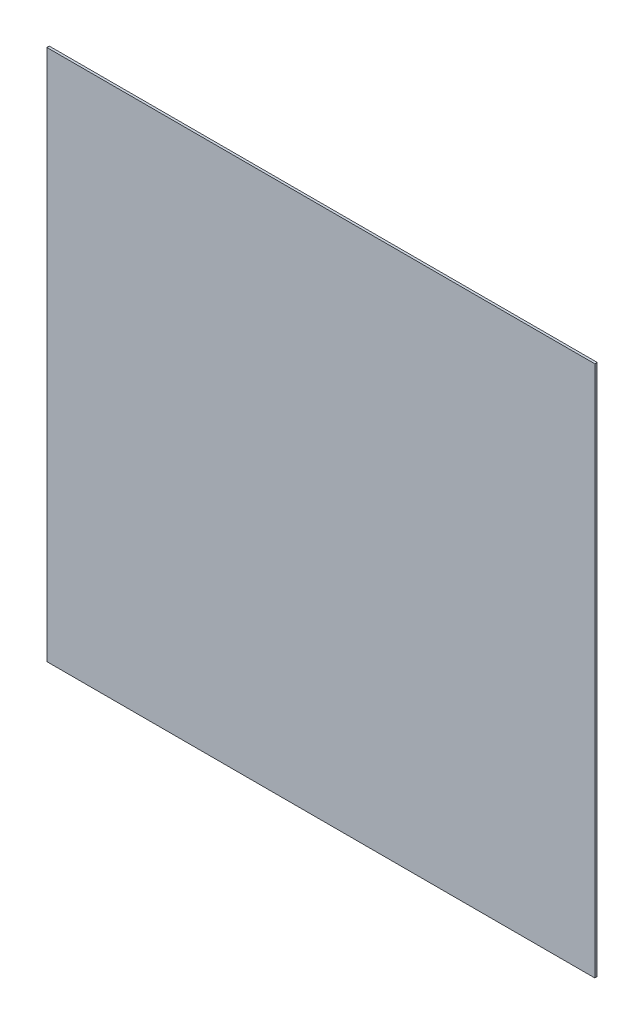
ISO-10303-21;
HEADER;
FILE_DESCRIPTION(('STEP AP214'),'2;1');
FILE_NAME('part.step','',(''),(''),'','','');
FILE_SCHEMA(('AUTOMOTIVE_DESIGN { 1 0 10303 214 1 1 1 1 }'));
ENDSEC;
DATA;
#1=APPLICATION_CONTEXT('core data for automotive mechanical design processes');
#2=APPLICATION_PROTOCOL_DEFINITION('international standard','automotive_design',2000,#1);
#3=PRODUCT_CONTEXT('',#1,'mechanical');
#4=PRODUCT('Part','Part','',(#3));
#5=PRODUCT_RELATED_PRODUCT_CATEGORY('part','',(#4));
#6=PRODUCT_DEFINITION_FORMATION('','',#4);
#7=PRODUCT_DEFINITION_CONTEXT('part definition',#1,'design');
#8=PRODUCT_DEFINITION('design','',#6,#7);
#9=PRODUCT_DEFINITION_SHAPE('','',#8);
#10=(LENGTH_UNIT() NAMED_UNIT(*) SI_UNIT(.MILLI.,.METRE.));
#11=(NAMED_UNIT(*) PLANE_ANGLE_UNIT() SI_UNIT($,.RADIAN.));
#12=(NAMED_UNIT(*) SI_UNIT($,.STERADIAN.) SOLID_ANGLE_UNIT());
#13=UNCERTAINTY_MEASURE_WITH_UNIT(LENGTH_MEASURE(1.E-05),#10,'distance_accuracy_value','');
#14=(GEOMETRIC_REPRESENTATION_CONTEXT(3) GLOBAL_UNCERTAINTY_ASSIGNED_CONTEXT((#13)) GLOBAL_UNIT_ASSIGNED_CONTEXT((#10,
#11,#12)) REPRESENTATION_CONTEXT('',''));
#15=CARTESIAN_POINT('',(0.,0.,0.));
#16=DIRECTION('',(0.,0.,1.));
#17=DIRECTION('',(1.,0.,0.));
#18=AXIS2_PLACEMENT_3D('',#15,#16,#17);
#19=CARTESIAN_POINT('',(-170.,165.,1.5));
#20=DIRECTION('',(1.,0.,0.));
#21=DIRECTION('',(0.,0.,-1.));
#22=AXIS2_PLACEMENT_3D('',#19,#20,#21);
#23=PLANE('',#22);
#24=DIRECTION('',(0.,-1.,0.));
#25=VECTOR('',#24,1.);
#26=CARTESIAN_POINT('',(-170.,165.,0.));
#27=LINE('',#26,#25);
#28=CARTESIAN_POINT('',(-170.,165.,0.));
#29=VERTEX_POINT('',#28);
#30=CARTESIAN_POINT('',(-170.,-165.,0.));
#31=VERTEX_POINT('',#30);
#32=EDGE_CURVE('E95',#29,#31,#27,.T.);
#33=ORIENTED_EDGE('',*,*,#32,.T.);
#34=DIRECTION('',(0.,0.,-1.));
#35=VECTOR('',#34,1.);
#36=CARTESIAN_POINT('',(-170.,-165.,1.5));
#37=LINE('',#36,#35);
#38=CARTESIAN_POINT('',(-170.,-165.,1.5));
#39=VERTEX_POINT('',#38);
#40=EDGE_CURVE('E11',#39,#31,#37,.T.);
#41=ORIENTED_EDGE('',*,*,#40,.F.);
#42=DIRECTION('',(0.,-1.,0.));
#43=VECTOR('',#42,1.);
#44=CARTESIAN_POINT('',(-170.,165.,1.5));
#45=LINE('',#44,#43);
#46=CARTESIAN_POINT('',(-170.,165.,1.5));
#47=VERTEX_POINT('',#46);
#48=EDGE_CURVE('E83',#47,#39,#45,.T.);
#49=ORIENTED_EDGE('',*,*,#48,.F.);
#50=DIRECTION('',(0.,0.,-1.));
#51=VECTOR('',#50,1.);
#52=CARTESIAN_POINT('',(-170.,165.,1.5));
#53=LINE('',#52,#51);
#54=EDGE_CURVE('E91',#47,#29,#53,.T.);
#55=ORIENTED_EDGE('',*,*,#54,.T.);
#56=EDGE_LOOP('',(#33,#41,#49,#55));
#57=FACE_BOUND('',#56,.T.);
#58=ADVANCED_FACE('F32',(#57),#23,.F.);
#59=CARTESIAN_POINT('',(-170.,-165.,1.5));
#60=DIRECTION('',(0.,1.,0.));
#61=DIRECTION('',(0.,0.,1.));
#62=AXIS2_PLACEMENT_3D('',#59,#60,#61);
#63=PLANE('',#62);
#64=DIRECTION('',(1.,0.,0.));
#65=VECTOR('',#64,1.);
#66=CARTESIAN_POINT('',(-170.,-165.,0.));
#67=LINE('',#66,#65);
#68=CARTESIAN_POINT('',(170.,-165.,0.));
#69=VERTEX_POINT('',#68);
#70=EDGE_CURVE('E87',#31,#69,#67,.T.);
#71=ORIENTED_EDGE('',*,*,#70,.T.);
#72=DIRECTION('',(0.,0.,-1.));
#73=VECTOR('',#72,1.);
#74=CARTESIAN_POINT('',(170.,-165.,1.5));
#75=LINE('',#74,#73);
#76=CARTESIAN_POINT('',(170.,-165.,1.5));
#77=VERTEX_POINT('',#76);
#78=EDGE_CURVE('E40',#77,#69,#75,.T.);
#79=ORIENTED_EDGE('',*,*,#78,.F.);
#80=DIRECTION('',(1.,0.,0.));
#81=VECTOR('',#80,1.);
#82=CARTESIAN_POINT('',(-170.,-165.,1.5));
#83=LINE('',#82,#81);
#84=EDGE_CURVE('E78',#39,#77,#83,.T.);
#85=ORIENTED_EDGE('',*,*,#84,.F.);
#86=ORIENTED_EDGE('',*,*,#40,.T.);
#87=EDGE_LOOP('',(#71,#79,#85,#86));
#88=FACE_BOUND('',#87,.T.);
#89=ADVANCED_FACE('F86',(#88),#63,.F.);
#90=CARTESIAN_POINT('',(170.,165.,1.5));
#91=DIRECTION('',(-1.,0.,0.));
#92=DIRECTION('',(0.,-1.,0.));
#93=AXIS2_PLACEMENT_3D('',#90,#91,#92);
#94=PLANE('',#93);
#95=DIRECTION('',(0.,1.,0.));
#96=VECTOR('',#95,1.);
#97=CARTESIAN_POINT('',(170.,165.,0.));
#98=LINE('',#97,#96);
#99=CARTESIAN_POINT('',(170.,165.,0.));
#100=VERTEX_POINT('',#99);
#101=EDGE_CURVE('E65',#69,#100,#98,.T.);
#102=ORIENTED_EDGE('',*,*,#101,.T.);
#103=DIRECTION('',(0.,0.,-1.));
#104=VECTOR('',#103,1.);
#105=CARTESIAN_POINT('',(170.,165.,1.5));
#106=LINE('',#105,#104);
#107=CARTESIAN_POINT('',(170.,165.,1.5));
#108=VERTEX_POINT('',#107);
#109=EDGE_CURVE('E88',#108,#100,#106,.T.);
#110=ORIENTED_EDGE('',*,*,#109,.F.);
#111=DIRECTION('',(0.,1.,0.));
#112=VECTOR('',#111,1.);
#113=CARTESIAN_POINT('',(170.,165.,1.5));
#114=LINE('',#113,#112);
#115=EDGE_CURVE('E81',#77,#108,#114,.T.);
#116=ORIENTED_EDGE('',*,*,#115,.F.);
#117=ORIENTED_EDGE('',*,*,#78,.T.);
#118=EDGE_LOOP('',(#102,#110,#116,#117));
#119=FACE_BOUND('',#118,.T.);
#120=ADVANCED_FACE('F89',(#119),#94,.F.);
#121=CARTESIAN_POINT('',(-170.,165.,1.5));
#122=DIRECTION('',(0.,-1.,0.));
#123=DIRECTION('',(0.,0.,-1.));
#124=AXIS2_PLACEMENT_3D('',#121,#122,#123);
#125=PLANE('',#124);
#126=DIRECTION('',(-1.,0.,0.));
#127=VECTOR('',#126,1.);
#128=CARTESIAN_POINT('',(-170.,165.,0.));
#129=LINE('',#128,#127);
#130=EDGE_CURVE('E71',#100,#29,#129,.T.);
#131=ORIENTED_EDGE('',*,*,#130,.T.);
#132=ORIENTED_EDGE('',*,*,#54,.F.);
#133=DIRECTION('',(-1.,0.,0.));
#134=VECTOR('',#133,1.);
#135=CARTESIAN_POINT('',(-170.,165.,1.5));
#136=LINE('',#135,#134);
#137=EDGE_CURVE('E48',#108,#47,#136,.T.);
#138=ORIENTED_EDGE('',*,*,#137,.F.);
#139=ORIENTED_EDGE('',*,*,#109,.T.);
#140=EDGE_LOOP('',(#131,#132,#138,#139));
#141=FACE_BOUND('',#140,.T.);
#142=ADVANCED_FACE('F102',(#141),#125,.F.);
#143=CARTESIAN_POINT('',(0.,0.,1.5));
#144=DIRECTION('',(0.,0.,1.));
#145=DIRECTION('',(1.,0.,0.));
#146=AXIS2_PLACEMENT_3D('',#143,#144,#145);
#147=PLANE('',#146);
#148=ORIENTED_EDGE('',*,*,#48,.T.);
#149=ORIENTED_EDGE('',*,*,#84,.T.);
#150=ORIENTED_EDGE('',*,*,#115,.T.);
#151=ORIENTED_EDGE('',*,*,#137,.T.);
#152=EDGE_LOOP('',(#148,#149,#150,#151));
#153=FACE_BOUND('',#152,.T.);
#154=ADVANCED_FACE('F79',(#153),#147,.T.);
#155=CARTESIAN_POINT('',(0.,0.,0.));
#156=DIRECTION('',(0.,0.,1.));
#157=DIRECTION('',(1.,0.,0.));
#158=AXIS2_PLACEMENT_3D('',#155,#156,#157);
#159=PLANE('',#158);
#160=ORIENTED_EDGE('',*,*,#32,.F.);
#161=ORIENTED_EDGE('',*,*,#130,.F.);
#162=ORIENTED_EDGE('',*,*,#101,.F.);
#163=ORIENTED_EDGE('',*,*,#70,.F.);
#164=EDGE_LOOP('',(#160,#161,#162,#163));
#165=FACE_BOUND('',#164,.T.);
#166=ADVANCED_FACE('F105',(#165),#159,.F.);
#167=CLOSED_SHELL('',(#58,#89,#120,#142,#154,#166));
#168=MANIFOLD_SOLID_BREP('B2',#167);
#169=ADVANCED_BREP_SHAPE_REPRESENTATION('',(#18,#168),#14);
#170=SHAPE_DEFINITION_REPRESENTATION(#9,#169);
ENDSEC;
END-ISO-10303-21;
